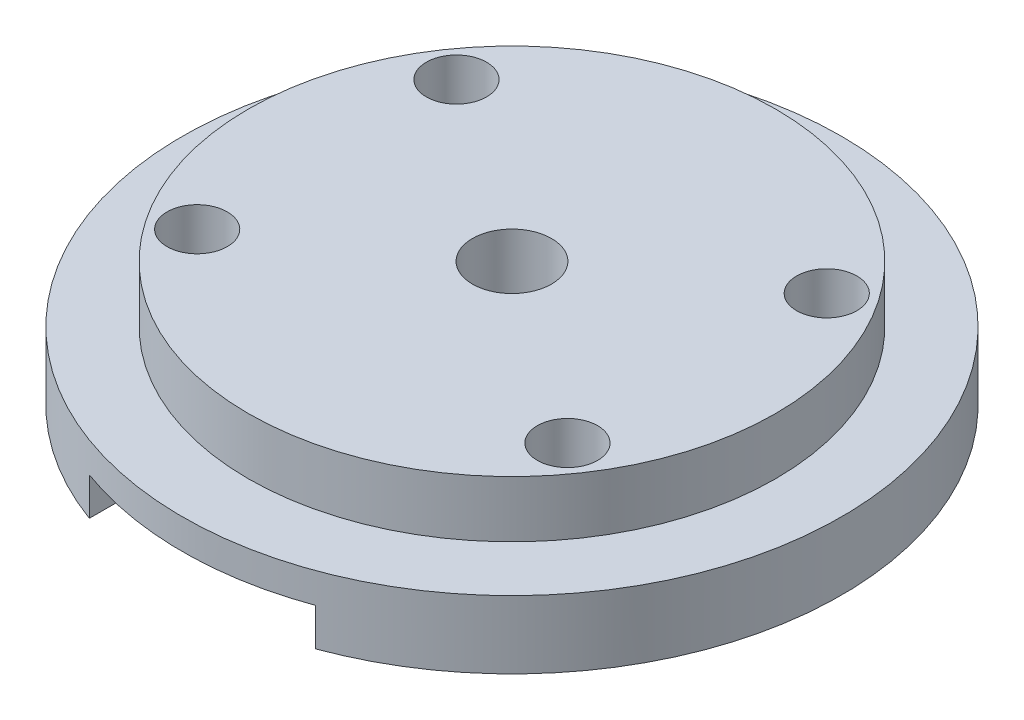
ISO-10303-21;
HEADER;
FILE_DESCRIPTION(('STEP AP214'),'2;1');
FILE_NAME('part.step','',(''),(''),'','','');
FILE_SCHEMA(('AUTOMOTIVE_DESIGN { 1 0 10303 214 1 1 1 1 }'));
ENDSEC;
DATA;
#1=APPLICATION_CONTEXT('core data for automotive mechanical design processes');
#2=APPLICATION_PROTOCOL_DEFINITION('international standard','automotive_design',2000,#1);
#3=PRODUCT_CONTEXT('',#1,'mechanical');
#4=PRODUCT('Part','Part','',(#3));
#5=PRODUCT_RELATED_PRODUCT_CATEGORY('part','',(#4));
#6=PRODUCT_DEFINITION_FORMATION('','',#4);
#7=PRODUCT_DEFINITION_CONTEXT('part definition',#1,'design');
#8=PRODUCT_DEFINITION('design','',#6,#7);
#9=PRODUCT_DEFINITION_SHAPE('','',#8);
#10=(LENGTH_UNIT() NAMED_UNIT(*) SI_UNIT(.MILLI.,.METRE.));
#11=(NAMED_UNIT(*) PLANE_ANGLE_UNIT() SI_UNIT($,.RADIAN.));
#12=(NAMED_UNIT(*) SI_UNIT($,.STERADIAN.) SOLID_ANGLE_UNIT());
#13=UNCERTAINTY_MEASURE_WITH_UNIT(LENGTH_MEASURE(1.E-05),#10,'distance_accuracy_value','');
#14=(GEOMETRIC_REPRESENTATION_CONTEXT(3) GLOBAL_UNCERTAINTY_ASSIGNED_CONTEXT((#13)) GLOBAL_UNIT_ASSIGNED_CONTEXT((#10,
#11,#12)) REPRESENTATION_CONTEXT('',''));
#15=CARTESIAN_POINT('',(0.,0.,0.));
#16=DIRECTION('',(0.,0.,1.));
#17=DIRECTION('',(1.,0.,0.));
#18=AXIS2_PLACEMENT_3D('',#15,#16,#17);
#19=CARTESIAN_POINT('',(0.,-1.6,0.));
#20=DIRECTION('',(0.,-1.,0.));
#21=DIRECTION('',(0.,0.,-1.));
#22=AXIS2_PLACEMENT_3D('',#19,#20,#21);
#23=PLANE('',#22);
#24=CARTESIAN_POINT('',(0.,-1.6,0.));
#25=DIRECTION('',(0.,-1.,0.));
#26=DIRECTION('',(0.,0.,-1.));
#27=AXIS2_PLACEMENT_3D('',#24,#25,#26);
#28=CIRCLE('',#27,2.1);
#29=CARTESIAN_POINT('',(0.,-1.6,-2.1));
#30=VERTEX_POINT('',#29);
#31=EDGE_CURVE('E110',#30,#30,#28,.T.);
#32=ORIENTED_EDGE('',*,*,#31,.F.);
#33=EDGE_LOOP('',(#32));
#34=FACE_BOUND('',#33,.T.);
#35=CARTESIAN_POINT('',(0.,-1.6,0.));
#36=DIRECTION('',(0.,-1.,0.));
#37=DIRECTION('',(0.,0.,-1.));
#38=AXIS2_PLACEMENT_3D('',#35,#36,#37);
#39=CIRCLE('',#38,17.5);
#40=CARTESIAN_POINT('',(-6.,-1.6,-16.4392822227736));
#41=VERTEX_POINT('',#40);
#42=CARTESIAN_POINT('',(6.,-1.6,-16.4392822227736));
#43=VERTEX_POINT('',#42);
#44=EDGE_CURVE('E51',#41,#43,#39,.T.);
#45=ORIENTED_EDGE('',*,*,#44,.T.);
#46=DIRECTION('',(0.,0.,-1.));
#47=VECTOR('',#46,1.);
#48=CARTESIAN_POINT('',(6.,-1.6,16.4392822227736));
#49=LINE('',#48,#47);
#50=CARTESIAN_POINT('',(6.,-1.6,16.4392822227736));
#51=VERTEX_POINT('',#50);
#52=EDGE_CURVE('E89',#51,#43,#49,.T.);
#53=ORIENTED_EDGE('',*,*,#52,.F.);
#54=CARTESIAN_POINT('',(-6.,-1.6,16.4392822227736));
#55=VERTEX_POINT('',#54);
#56=EDGE_CURVE('E94',#51,#55,#39,.T.);
#57=ORIENTED_EDGE('',*,*,#56,.T.);
#58=DIRECTION('',(0.,0.,1.));
#59=VECTOR('',#58,1.);
#60=CARTESIAN_POINT('',(-6.,-1.6,16.4392822227736));
#61=LINE('',#60,#59);
#62=EDGE_CURVE('E56',#41,#55,#61,.T.);
#63=ORIENTED_EDGE('',*,*,#62,.F.);
#64=EDGE_LOOP('',(#45,#53,#57,#63));
#65=FACE_BOUND('',#64,.T.);
#66=ADVANCED_FACE('F35',(#34,#65),#23,.T.);
#67=CARTESIAN_POINT('',(0.,3.,0.));
#68=DIRECTION('',(0.,1.,0.));
#69=DIRECTION('',(0.,0.,1.));
#70=AXIS2_PLACEMENT_3D('',#67,#68,#69);
#71=PLANE('',#70);
#72=CARTESIAN_POINT('',(9.82982453146791,3.,-6.88291723621254));
#73=DIRECTION('',(0.,-1.,0.));
#74=DIRECTION('',(0.,0.,-1.));
#75=AXIS2_PLACEMENT_3D('',#72,#73,#74);
#76=CIRCLE('',#75,1.6);
#77=CARTESIAN_POINT('',(9.82982453146791,3.,-8.48291723621254));
#78=VERTEX_POINT('',#77);
#79=EDGE_CURVE('E193',#78,#78,#76,.T.);
#80=ORIENTED_EDGE('',*,*,#79,.T.);
#81=EDGE_LOOP('',(#80));
#82=FACE_BOUND('',#81,.T.);
#83=CARTESIAN_POINT('',(-9.82982453146792,3.,6.88291723621254));
#84=DIRECTION('',(0.,-1.,0.));
#85=DIRECTION('',(0.,0.,-1.));
#86=AXIS2_PLACEMENT_3D('',#83,#84,#85);
#87=CIRCLE('',#86,1.6);
#88=CARTESIAN_POINT('',(-9.82982453146792,3.,5.28291723621253));
#89=VERTEX_POINT('',#88);
#90=EDGE_CURVE('E183',#89,#89,#87,.T.);
#91=ORIENTED_EDGE('',*,*,#90,.T.);
#92=EDGE_LOOP('',(#91));
#93=FACE_BOUND('',#92,.T.);
#94=CARTESIAN_POINT('',(-9.82982453146792,3.,-6.88291723621254));
#95=DIRECTION('',(0.,-1.,0.));
#96=DIRECTION('',(0.,0.,1.));
#97=AXIS2_PLACEMENT_3D('',#94,#95,#96);
#98=CIRCLE('',#97,1.6);
#99=CARTESIAN_POINT('',(-9.82982453146792,3.,-5.28291723621254));
#100=VERTEX_POINT('',#99);
#101=EDGE_CURVE('E178',#100,#100,#98,.T.);
#102=ORIENTED_EDGE('',*,*,#101,.T.);
#103=EDGE_LOOP('',(#102));
#104=FACE_BOUND('',#103,.T.);
#105=CARTESIAN_POINT('',(9.82982453146791,3.,6.88291723621254));
#106=DIRECTION('',(0.,-1.,0.));
#107=DIRECTION('',(0.,0.,-1.));
#108=AXIS2_PLACEMENT_3D('',#105,#106,#107);
#109=CIRCLE('',#108,1.6);
#110=CARTESIAN_POINT('',(9.82982453146791,3.,5.28291723621253));
#111=VERTEX_POINT('',#110);
#112=EDGE_CURVE('E199',#111,#111,#109,.T.);
#113=ORIENTED_EDGE('',*,*,#112,.T.);
#114=EDGE_LOOP('',(#113));
#115=FACE_BOUND('',#114,.T.);
#116=CARTESIAN_POINT('',(0.,3.,0.));
#117=DIRECTION('',(0.,1.,0.));
#118=DIRECTION('',(0.,0.,1.));
#119=AXIS2_PLACEMENT_3D('',#116,#117,#118);
#120=CIRCLE('',#119,14.);
#121=CARTESIAN_POINT('',(0.,3.,14.));
#122=VERTEX_POINT('',#121);
#123=EDGE_CURVE('E11',#122,#122,#120,.T.);
#124=ORIENTED_EDGE('',*,*,#123,.T.);
#125=EDGE_LOOP('',(#124));
#126=FACE_BOUND('',#125,.T.);
#127=CARTESIAN_POINT('',(0.,3.,0.));
#128=DIRECTION('',(0.,1.,0.));
#129=DIRECTION('',(0.,0.,1.));
#130=AXIS2_PLACEMENT_3D('',#127,#128,#129);
#131=CIRCLE('',#130,2.1);
#132=CARTESIAN_POINT('',(0.,3.,2.1));
#133=VERTEX_POINT('',#132);
#134=EDGE_CURVE('E44',#133,#133,#131,.T.);
#135=ORIENTED_EDGE('',*,*,#134,.F.);
#136=EDGE_LOOP('',(#135));
#137=FACE_BOUND('',#136,.T.);
#138=ADVANCED_FACE('F141',(#82,#93,#104,#115,#126,#137),#71,.T.);
#139=CARTESIAN_POINT('',(0.,3.,0.));
#140=DIRECTION('',(0.,-1.,0.));
#141=DIRECTION('',(0.,0.,-1.));
#142=AXIS2_PLACEMENT_3D('',#139,#140,#141);
#143=CYLINDRICAL_SURFACE('',#142,14.);
#144=ORIENTED_EDGE('',*,*,#123,.F.);
#145=EDGE_LOOP('',(#144));
#146=FACE_BOUND('',#145,.T.);
#147=CARTESIAN_POINT('',(0.,0.,0.));
#148=DIRECTION('',(0.,1.,0.));
#149=DIRECTION('',(0.,0.,1.));
#150=AXIS2_PLACEMENT_3D('',#147,#148,#149);
#151=CIRCLE('',#150,14.);
#152=CARTESIAN_POINT('',(0.,0.,14.));
#153=VERTEX_POINT('',#152);
#154=EDGE_CURVE('E39',#153,#153,#151,.T.);
#155=ORIENTED_EDGE('',*,*,#154,.T.);
#156=EDGE_LOOP('',(#155));
#157=FACE_BOUND('',#156,.T.);
#158=ADVANCED_FACE('F37',(#146,#157),#143,.T.);
#159=CARTESIAN_POINT('',(0.,3.,0.));
#160=DIRECTION('',(0.,-1.,0.));
#161=DIRECTION('',(0.,0.,-1.));
#162=AXIS2_PLACEMENT_3D('',#159,#160,#161);
#163=CYLINDRICAL_SURFACE('',#162,2.1);
#164=ORIENTED_EDGE('',*,*,#134,.T.);
#165=EDGE_LOOP('',(#164));
#166=FACE_BOUND('',#165,.T.);
#167=ORIENTED_EDGE('',*,*,#31,.T.);
#168=EDGE_LOOP('',(#167));
#169=FACE_BOUND('',#168,.T.);
#170=ADVANCED_FACE('F127',(#166,#169),#163,.F.);
#171=CARTESIAN_POINT('',(0.,0.,0.));
#172=DIRECTION('',(0.,-1.,0.));
#173=DIRECTION('',(0.,0.,-1.));
#174=AXIS2_PLACEMENT_3D('',#171,#172,#173);
#175=PLANE('',#174);
#176=ORIENTED_EDGE('',*,*,#154,.F.);
#177=EDGE_LOOP('',(#176));
#178=FACE_BOUND('',#177,.T.);
#179=CARTESIAN_POINT('',(0.,0.,0.));
#180=DIRECTION('',(0.,-1.,0.));
#181=DIRECTION('',(0.,0.,-1.));
#182=AXIS2_PLACEMENT_3D('',#179,#180,#181);
#183=CIRCLE('',#182,17.5);
#184=CARTESIAN_POINT('',(0.,0.,-17.5));
#185=VERTEX_POINT('',#184);
#186=EDGE_CURVE('E113',#185,#185,#183,.T.);
#187=ORIENTED_EDGE('',*,*,#186,.F.);
#188=EDGE_LOOP('',(#187));
#189=FACE_BOUND('',#188,.T.);
#190=ADVANCED_FACE('F124',(#178,#189),#175,.F.);
#191=CARTESIAN_POINT('',(0.,-1.6,0.));
#192=DIRECTION('',(0.,1.,0.));
#193=DIRECTION('',(0.,0.,1.));
#194=AXIS2_PLACEMENT_3D('',#191,#192,#193);
#195=CYLINDRICAL_SURFACE('',#194,17.5);
#196=ORIENTED_EDGE('',*,*,#44,.F.);
#197=DIRECTION('',(0.,1.,0.));
#198=VECTOR('',#197,1.);
#199=CARTESIAN_POINT('',(-6.,-3.6,-16.4392822227736));
#200=LINE('',#199,#198);
#201=CARTESIAN_POINT('',(-6.,-3.6,-16.4392822227736));
#202=VERTEX_POINT('',#201);
#203=EDGE_CURVE('E107',#202,#41,#200,.T.);
#204=ORIENTED_EDGE('',*,*,#203,.F.);
#205=CARTESIAN_POINT('',(0.,-3.6,0.));
#206=DIRECTION('',(0.,-1.,0.));
#207=DIRECTION('',(0.,0.,-1.));
#208=AXIS2_PLACEMENT_3D('',#205,#206,#207);
#209=CIRCLE('',#208,17.5);
#210=CARTESIAN_POINT('',(-6.,-3.6,16.4392822227736));
#211=VERTEX_POINT('',#210);
#212=EDGE_CURVE('E96',#211,#202,#209,.T.);
#213=ORIENTED_EDGE('',*,*,#212,.F.);
#214=DIRECTION('',(0.,1.,0.));
#215=VECTOR('',#214,1.);
#216=CARTESIAN_POINT('',(-6.,-3.6,16.4392822227736));
#217=LINE('',#216,#215);
#218=EDGE_CURVE('E104',#211,#55,#217,.T.);
#219=ORIENTED_EDGE('',*,*,#218,.T.);
#220=ORIENTED_EDGE('',*,*,#56,.F.);
#221=DIRECTION('',(0.,1.,0.));
#222=VECTOR('',#221,1.);
#223=CARTESIAN_POINT('',(6.,-3.6,16.4392822227736));
#224=LINE('',#223,#222);
#225=CARTESIAN_POINT('',(6.,-3.6,16.4392822227736));
#226=VERTEX_POINT('',#225);
#227=EDGE_CURVE('E80',#226,#51,#224,.T.);
#228=ORIENTED_EDGE('',*,*,#227,.F.);
#229=CARTESIAN_POINT('',(0.,-3.6,0.));
#230=DIRECTION('',(0.,-1.,0.));
#231=DIRECTION('',(0.,0.,1.));
#232=AXIS2_PLACEMENT_3D('',#229,#230,#231);
#233=CIRCLE('',#232,17.5);
#234=CARTESIAN_POINT('',(6.,-3.6,-16.4392822227736));
#235=VERTEX_POINT('',#234);
#236=EDGE_CURVE('E85',#235,#226,#233,.T.);
#237=ORIENTED_EDGE('',*,*,#236,.F.);
#238=DIRECTION('',(0.,1.,0.));
#239=VECTOR('',#238,1.);
#240=CARTESIAN_POINT('',(6.,-3.6,-16.4392822227736));
#241=LINE('',#240,#239);
#242=EDGE_CURVE('E82',#235,#43,#241,.T.);
#243=ORIENTED_EDGE('',*,*,#242,.T.);
#244=EDGE_LOOP('',(#196,#204,#213,#219,#220,#228,#237,#243));
#245=FACE_BOUND('',#244,.T.);
#246=ORIENTED_EDGE('',*,*,#186,.T.);
#247=EDGE_LOOP('',(#246));
#248=FACE_BOUND('',#247,.T.);
#249=ADVANCED_FACE('F91',(#245,#248),#195,.T.);
#250=CARTESIAN_POINT('',(-6.,-3.6,16.4392822227736));
#251=DIRECTION('',(-1.,0.,0.));
#252=DIRECTION('',(0.,0.,1.));
#253=AXIS2_PLACEMENT_3D('',#250,#251,#252);
#254=PLANE('',#253);
#255=ORIENTED_EDGE('',*,*,#62,.T.);
#256=ORIENTED_EDGE('',*,*,#218,.F.);
#257=DIRECTION('',(0.,0.,1.));
#258=VECTOR('',#257,1.);
#259=CARTESIAN_POINT('',(-6.,-3.6,16.4392822227736));
#260=LINE('',#259,#258);
#261=EDGE_CURVE('E103',#202,#211,#260,.T.);
#262=ORIENTED_EDGE('',*,*,#261,.F.);
#263=ORIENTED_EDGE('',*,*,#203,.T.);
#264=EDGE_LOOP('',(#255,#256,#262,#263));
#265=FACE_BOUND('',#264,.T.);
#266=ADVANCED_FACE('F131',(#265),#254,.F.);
#267=CARTESIAN_POINT('',(0.,-3.6,0.));
#268=DIRECTION('',(0.,-1.,0.));
#269=DIRECTION('',(0.,0.,-1.));
#270=AXIS2_PLACEMENT_3D('',#267,#268,#269);
#271=PLANE('',#270);
#272=CARTESIAN_POINT('',(-9.82982453146792,-3.6,6.88291723621254));
#273=DIRECTION('',(0.,-1.,0.));
#274=DIRECTION('',(0.,0.,-1.));
#275=AXIS2_PLACEMENT_3D('',#272,#273,#274);
#276=CIRCLE('',#275,1.6);
#277=CARTESIAN_POINT('',(-9.82982453146792,-3.6,5.28291723621253));
#278=VERTEX_POINT('',#277);
#279=EDGE_CURVE('E188',#278,#278,#276,.T.);
#280=ORIENTED_EDGE('',*,*,#279,.F.);
#281=EDGE_LOOP('',(#280));
#282=FACE_BOUND('',#281,.T.);
#283=CARTESIAN_POINT('',(-9.82982453146792,-3.6,-6.88291723621254));
#284=DIRECTION('',(0.,-1.,0.));
#285=DIRECTION('',(0.,0.,1.));
#286=AXIS2_PLACEMENT_3D('',#283,#284,#285);
#287=CIRCLE('',#286,1.6);
#288=CARTESIAN_POINT('',(-9.82982453146792,-3.6,-5.28291723621254));
#289=VERTEX_POINT('',#288);
#290=EDGE_CURVE('E181',#289,#289,#287,.T.);
#291=ORIENTED_EDGE('',*,*,#290,.F.);
#292=EDGE_LOOP('',(#291));
#293=FACE_BOUND('',#292,.T.);
#294=ORIENTED_EDGE('',*,*,#212,.T.);
#295=ORIENTED_EDGE('',*,*,#261,.T.);
#296=EDGE_LOOP('',(#294,#295));
#297=FACE_BOUND('',#296,.T.);
#298=ADVANCED_FACE('F136',(#282,#293,#297),#271,.T.);
#299=CARTESIAN_POINT('',(6.,-3.6,16.4392822227736));
#300=DIRECTION('',(1.,0.,0.));
#301=DIRECTION('',(0.,0.,-1.));
#302=AXIS2_PLACEMENT_3D('',#299,#300,#301);
#303=PLANE('',#302);
#304=ORIENTED_EDGE('',*,*,#52,.T.);
#305=ORIENTED_EDGE('',*,*,#242,.F.);
#306=DIRECTION('',(0.,0.,-1.));
#307=VECTOR('',#306,1.);
#308=CARTESIAN_POINT('',(6.,-3.6,16.4392822227736));
#309=LINE('',#308,#307);
#310=EDGE_CURVE('E76',#226,#235,#309,.T.);
#311=ORIENTED_EDGE('',*,*,#310,.F.);
#312=ORIENTED_EDGE('',*,*,#227,.T.);
#313=EDGE_LOOP('',(#304,#305,#311,#312));
#314=FACE_BOUND('',#313,.T.);
#315=ADVANCED_FACE('F78',(#314),#303,.F.);
#316=CARTESIAN_POINT('',(0.,-3.6,0.));
#317=DIRECTION('',(0.,1.,0.));
#318=DIRECTION('',(0.,0.,1.));
#319=AXIS2_PLACEMENT_3D('',#316,#317,#318);
#320=PLANE('',#319);
#321=CARTESIAN_POINT('',(9.82982453146791,-3.6,-6.88291723621254));
#322=DIRECTION('',(0.,-1.,0.));
#323=DIRECTION('',(0.,0.,-1.));
#324=AXIS2_PLACEMENT_3D('',#321,#322,#323);
#325=CIRCLE('',#324,1.6);
#326=CARTESIAN_POINT('',(9.82982453146791,-3.6,-8.48291723621254));
#327=VERTEX_POINT('',#326);
#328=EDGE_CURVE('E196',#327,#327,#325,.T.);
#329=ORIENTED_EDGE('',*,*,#328,.F.);
#330=EDGE_LOOP('',(#329));
#331=FACE_BOUND('',#330,.T.);
#332=CARTESIAN_POINT('',(9.82982453146791,-3.6,6.88291723621254));
#333=DIRECTION('',(0.,-1.,0.));
#334=DIRECTION('',(0.,0.,-1.));
#335=AXIS2_PLACEMENT_3D('',#332,#333,#334);
#336=CIRCLE('',#335,1.6);
#337=CARTESIAN_POINT('',(9.82982453146791,-3.6,5.28291723621253));
#338=VERTEX_POINT('',#337);
#339=EDGE_CURVE('E185',#338,#338,#336,.T.);
#340=ORIENTED_EDGE('',*,*,#339,.F.);
#341=EDGE_LOOP('',(#340));
#342=FACE_BOUND('',#341,.T.);
#343=ORIENTED_EDGE('',*,*,#236,.T.);
#344=ORIENTED_EDGE('',*,*,#310,.T.);
#345=EDGE_LOOP('',(#343,#344));
#346=FACE_BOUND('',#345,.T.);
#347=ADVANCED_FACE('F87',(#331,#342,#346),#320,.F.);
#348=CARTESIAN_POINT('',(9.82982453146791,3.,6.88291723621254));
#349=DIRECTION('',(0.,-1.,0.));
#350=DIRECTION('',(0.,0.,-1.));
#351=AXIS2_PLACEMENT_3D('',#348,#349,#350);
#352=CYLINDRICAL_SURFACE('',#351,1.6);
#353=ORIENTED_EDGE('',*,*,#112,.F.);
#354=EDGE_LOOP('',(#353));
#355=FACE_BOUND('',#354,.T.);
#356=ORIENTED_EDGE('',*,*,#339,.T.);
#357=EDGE_LOOP('',(#356));
#358=FACE_BOUND('',#357,.T.);
#359=ADVANCED_FACE('F157',(#355,#358),#352,.F.);
#360=CARTESIAN_POINT('',(9.82982453146791,3.,-6.88291723621254));
#361=DIRECTION('',(0.,-1.,0.));
#362=DIRECTION('',(0.,0.,-1.));
#363=AXIS2_PLACEMENT_3D('',#360,#361,#362);
#364=CYLINDRICAL_SURFACE('',#363,1.6);
#365=ORIENTED_EDGE('',*,*,#79,.F.);
#366=EDGE_LOOP('',(#365));
#367=FACE_BOUND('',#366,.T.);
#368=ORIENTED_EDGE('',*,*,#328,.T.);
#369=EDGE_LOOP('',(#368));
#370=FACE_BOUND('',#369,.T.);
#371=ADVANCED_FACE('F161',(#367,#370),#364,.F.);
#372=CARTESIAN_POINT('',(-9.82982453146792,3.,-6.88291723621254));
#373=DIRECTION('',(0.,-1.,0.));
#374=DIRECTION('',(0.,0.,-1.));
#375=AXIS2_PLACEMENT_3D('',#372,#373,#374);
#376=CYLINDRICAL_SURFACE('',#375,1.6);
#377=ORIENTED_EDGE('',*,*,#101,.F.);
#378=EDGE_LOOP('',(#377));
#379=FACE_BOUND('',#378,.T.);
#380=ORIENTED_EDGE('',*,*,#290,.T.);
#381=EDGE_LOOP('',(#380));
#382=FACE_BOUND('',#381,.T.);
#383=ADVANCED_FACE('F165',(#379,#382),#376,.F.);
#384=CARTESIAN_POINT('',(-9.82982453146792,3.,6.88291723621254));
#385=DIRECTION('',(0.,-1.,0.));
#386=DIRECTION('',(0.,0.,-1.));
#387=AXIS2_PLACEMENT_3D('',#384,#385,#386);
#388=CYLINDRICAL_SURFACE('',#387,1.6);
#389=ORIENTED_EDGE('',*,*,#90,.F.);
#390=EDGE_LOOP('',(#389));
#391=FACE_BOUND('',#390,.T.);
#392=ORIENTED_EDGE('',*,*,#279,.T.);
#393=EDGE_LOOP('',(#392));
#394=FACE_BOUND('',#393,.T.);
#395=ADVANCED_FACE('F167',(#391,#394),#388,.F.);
#396=CLOSED_SHELL('',(#66,#138,#158,#170,#190,#249,#266,#298,#315,#347,#359,#371,#383,#395));
#397=MANIFOLD_SOLID_BREP('B2',#396);
#398=ADVANCED_BREP_SHAPE_REPRESENTATION('',(#18,#397),#14);
#399=SHAPE_DEFINITION_REPRESENTATION(#9,#398);
ENDSEC;
END-ISO-10303-21;
